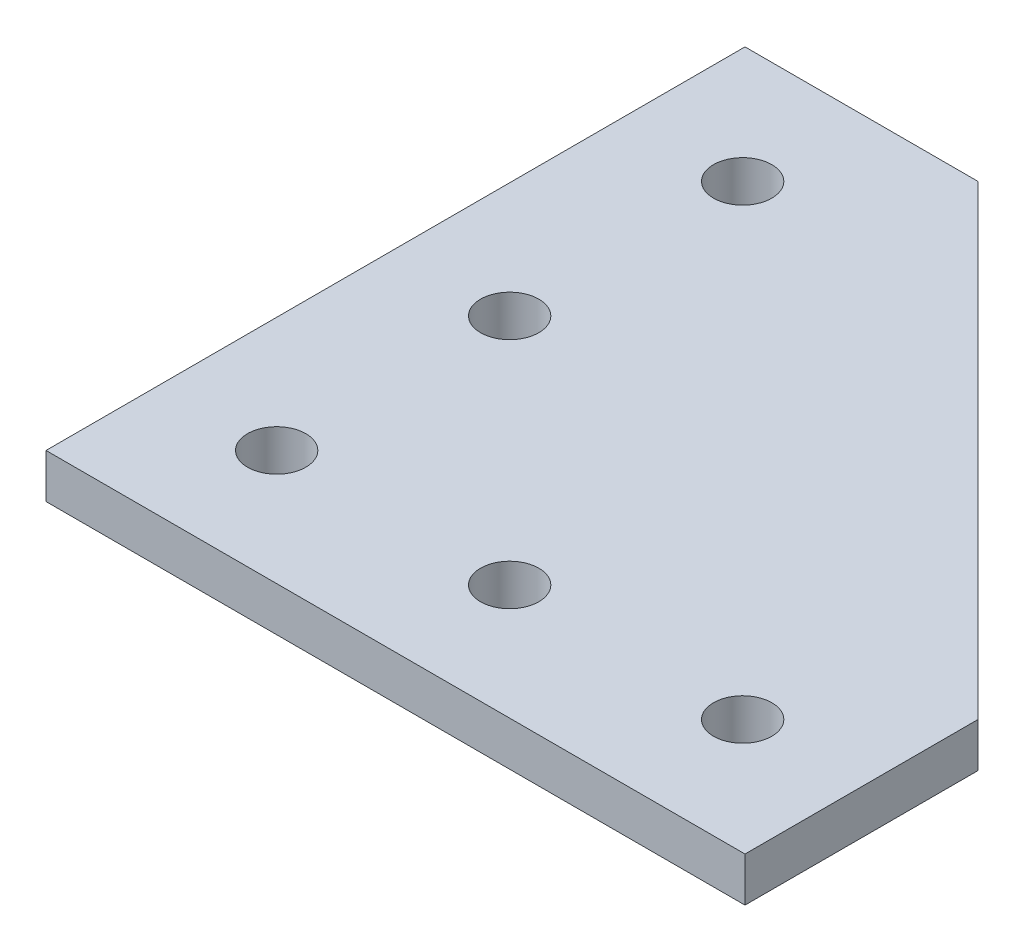
ISO-10303-21;
HEADER;
FILE_DESCRIPTION(('STEP AP214'),'2;1');
FILE_NAME('part.step','',(''),(''),'','','');
FILE_SCHEMA(('AUTOMOTIVE_DESIGN { 1 0 10303 214 1 1 1 1 }'));
ENDSEC;
DATA;
#1=APPLICATION_CONTEXT('core data for automotive mechanical design processes');
#2=APPLICATION_PROTOCOL_DEFINITION('international standard','automotive_design',2000,#1);
#3=PRODUCT_CONTEXT('',#1,'mechanical');
#4=PRODUCT('Part','Part','',(#3));
#5=PRODUCT_RELATED_PRODUCT_CATEGORY('part','',(#4));
#6=PRODUCT_DEFINITION_FORMATION('','',#4);
#7=PRODUCT_DEFINITION_CONTEXT('part definition',#1,'design');
#8=PRODUCT_DEFINITION('design','',#6,#7);
#9=PRODUCT_DEFINITION_SHAPE('','',#8);
#10=(LENGTH_UNIT() NAMED_UNIT(*) SI_UNIT(.MILLI.,.METRE.));
#11=(NAMED_UNIT(*) PLANE_ANGLE_UNIT() SI_UNIT($,.RADIAN.));
#12=(NAMED_UNIT(*) SI_UNIT($,.STERADIAN.) SOLID_ANGLE_UNIT());
#13=UNCERTAINTY_MEASURE_WITH_UNIT(LENGTH_MEASURE(1.E-05),#10,'distance_accuracy_value','');
#14=(GEOMETRIC_REPRESENTATION_CONTEXT(3) GLOBAL_UNCERTAINTY_ASSIGNED_CONTEXT((#13)) GLOBAL_UNIT_ASSIGNED_CONTEXT((#10,
#11,#12)) REPRESENTATION_CONTEXT('',''));
#15=CARTESIAN_POINT('',(0.,0.,0.));
#16=DIRECTION('',(0.,0.,1.));
#17=DIRECTION('',(1.,0.,0.));
#18=AXIS2_PLACEMENT_3D('',#15,#16,#17);
#19=CARTESIAN_POINT('',(0.,4.826,0.));
#20=DIRECTION('',(0.,1.,0.));
#21=DIRECTION('',(0.,0.,1.));
#22=AXIS2_PLACEMENT_3D('',#19,#20,#21);
#23=PLANE('',#22);
#24=CARTESIAN_POINT('',(12.573,4.826,-37.973));
#25=DIRECTION('',(0.,1.,0.));
#26=DIRECTION('',(0.,0.,1.));
#27=AXIS2_PLACEMENT_3D('',#24,#25,#26);
#28=CIRCLE('',#27,3.175);
#29=CARTESIAN_POINT('',(12.573,4.826,-34.798));
#30=VERTEX_POINT('',#29);
#31=EDGE_CURVE('E203',#30,#30,#28,.T.);
#32=ORIENTED_EDGE('',*,*,#31,.F.);
#33=EDGE_LOOP('',(#32));
#34=FACE_BOUND('',#33,.T.);
#35=CARTESIAN_POINT('',(37.973,4.826,-12.573));
#36=DIRECTION('',(0.,1.,0.));
#37=DIRECTION('',(0.,0.,1.));
#38=AXIS2_PLACEMENT_3D('',#35,#36,#37);
#39=CIRCLE('',#38,3.175);
#40=CARTESIAN_POINT('',(37.973,4.826,-9.39800000000001));
#41=VERTEX_POINT('',#40);
#42=EDGE_CURVE('E219',#41,#41,#39,.T.);
#43=ORIENTED_EDGE('',*,*,#42,.F.);
#44=EDGE_LOOP('',(#43));
#45=FACE_BOUND('',#44,.T.);
#46=DIRECTION('',(0.,0.,1.));
#47=VECTOR('',#46,1.);
#48=CARTESIAN_POINT('',(0.,4.826,-76.2));
#49=LINE('',#48,#47);
#50=CARTESIAN_POINT('',(0.,4.826,-76.2));
#51=VERTEX_POINT('',#50);
#52=CARTESIAN_POINT('',(0.,4.826,0.));
#53=VERTEX_POINT('',#52);
#54=EDGE_CURVE('E139',#51,#53,#49,.T.);
#55=ORIENTED_EDGE('',*,*,#54,.T.);
#56=DIRECTION('',(1.,0.,0.));
#57=VECTOR('',#56,1.);
#58=CARTESIAN_POINT('',(0.,4.826,0.));
#59=LINE('',#58,#57);
#60=CARTESIAN_POINT('',(76.2,4.826,0.));
#61=VERTEX_POINT('',#60);
#62=EDGE_CURVE('E97',#53,#61,#59,.T.);
#63=ORIENTED_EDGE('',*,*,#62,.T.);
#64=DIRECTION('',(0.,0.,-1.));
#65=VECTOR('',#64,1.);
#66=CARTESIAN_POINT('',(76.2,4.826,0.));
#67=LINE('',#66,#65);
#68=CARTESIAN_POINT('',(76.2,4.826,-25.4));
#69=VERTEX_POINT('',#68);
#70=EDGE_CURVE('E101',#61,#69,#67,.T.);
#71=ORIENTED_EDGE('',*,*,#70,.T.);
#72=DIRECTION('',(-0.707106781186548,0.,-0.707106781186547));
#73=VECTOR('',#72,1.);
#74=CARTESIAN_POINT('',(76.2,4.826,-25.4));
#75=LINE('',#74,#73);
#76=CARTESIAN_POINT('',(25.4,4.826,-76.2));
#77=VERTEX_POINT('',#76);
#78=EDGE_CURVE('E105',#69,#77,#75,.T.);
#79=ORIENTED_EDGE('',*,*,#78,.T.);
#80=DIRECTION('',(-1.,0.,0.));
#81=VECTOR('',#80,1.);
#82=CARTESIAN_POINT('',(25.4,4.826,-76.2));
#83=LINE('',#82,#81);
#84=EDGE_CURVE('E63',#77,#51,#83,.T.);
#85=ORIENTED_EDGE('',*,*,#84,.T.);
#86=EDGE_LOOP('',(#55,#63,#71,#79,#85));
#87=FACE_BOUND('',#86,.T.);
#88=CARTESIAN_POINT('',(12.573,4.826,-12.573));
#89=DIRECTION('',(0.,1.,0.));
#90=DIRECTION('',(0.,0.,1.));
#91=AXIS2_PLACEMENT_3D('',#88,#89,#90);
#92=CIRCLE('',#91,3.175);
#93=CARTESIAN_POINT('',(12.573,4.826,-9.398));
#94=VERTEX_POINT('',#93);
#95=EDGE_CURVE('E130',#94,#94,#92,.T.);
#96=ORIENTED_EDGE('',*,*,#95,.F.);
#97=EDGE_LOOP('',(#96));
#98=FACE_BOUND('',#97,.T.);
#99=CARTESIAN_POINT('',(63.373,4.826,-12.573));
#100=DIRECTION('',(0.,1.,0.));
#101=DIRECTION('',(0.,0.,1.));
#102=AXIS2_PLACEMENT_3D('',#99,#100,#101);
#103=CIRCLE('',#102,3.175);
#104=CARTESIAN_POINT('',(63.373,4.826,-9.39800000000001));
#105=VERTEX_POINT('',#104);
#106=EDGE_CURVE('E211',#105,#105,#103,.T.);
#107=ORIENTED_EDGE('',*,*,#106,.F.);
#108=EDGE_LOOP('',(#107));
#109=FACE_BOUND('',#108,.T.);
#110=CARTESIAN_POINT('',(12.573,4.826,-63.373));
#111=DIRECTION('',(0.,1.,0.));
#112=DIRECTION('',(0.,0.,1.));
#113=AXIS2_PLACEMENT_3D('',#110,#111,#112);
#114=CIRCLE('',#113,3.175);
#115=CARTESIAN_POINT('',(12.573,4.826,-60.198));
#116=VERTEX_POINT('',#115);
#117=EDGE_CURVE('E192',#116,#116,#114,.T.);
#118=ORIENTED_EDGE('',*,*,#117,.F.);
#119=EDGE_LOOP('',(#118));
#120=FACE_BOUND('',#119,.T.);
#121=ADVANCED_FACE('F45',(#34,#45,#87,#98,#109,#120),#23,.T.);
#122=CARTESIAN_POINT('',(0.,0.,0.));
#123=DIRECTION('',(0.,1.,0.));
#124=DIRECTION('',(0.,0.,1.));
#125=AXIS2_PLACEMENT_3D('',#122,#123,#124);
#126=PLANE('',#125);
#127=DIRECTION('',(0.,0.,1.));
#128=VECTOR('',#127,1.);
#129=CARTESIAN_POINT('',(0.,0.,-76.2));
#130=LINE('',#129,#128);
#131=CARTESIAN_POINT('',(0.,0.,-76.2));
#132=VERTEX_POINT('',#131);
#133=CARTESIAN_POINT('',(0.,0.,0.));
#134=VERTEX_POINT('',#133);
#135=EDGE_CURVE('E125',#132,#134,#130,.T.);
#136=ORIENTED_EDGE('',*,*,#135,.F.);
#137=DIRECTION('',(-1.,0.,0.));
#138=VECTOR('',#137,1.);
#139=CARTESIAN_POINT('',(25.4,0.,-76.2));
#140=LINE('',#139,#138);
#141=CARTESIAN_POINT('',(25.4,0.,-76.2));
#142=VERTEX_POINT('',#141);
#143=EDGE_CURVE('E89',#142,#132,#140,.T.);
#144=ORIENTED_EDGE('',*,*,#143,.F.);
#145=DIRECTION('',(-0.707106781186548,0.,-0.707106781186547));
#146=VECTOR('',#145,1.);
#147=CARTESIAN_POINT('',(76.2,0.,-25.4));
#148=LINE('',#147,#146);
#149=CARTESIAN_POINT('',(76.2,0.,-25.4));
#150=VERTEX_POINT('',#149);
#151=EDGE_CURVE('E83',#150,#142,#148,.T.);
#152=ORIENTED_EDGE('',*,*,#151,.F.);
#153=DIRECTION('',(0.,0.,-1.));
#154=VECTOR('',#153,1.);
#155=CARTESIAN_POINT('',(76.2,0.,0.));
#156=LINE('',#155,#154);
#157=CARTESIAN_POINT('',(76.2,0.,0.));
#158=VERTEX_POINT('',#157);
#159=EDGE_CURVE('E113',#158,#150,#156,.T.);
#160=ORIENTED_EDGE('',*,*,#159,.F.);
#161=DIRECTION('',(1.,0.,0.));
#162=VECTOR('',#161,1.);
#163=CARTESIAN_POINT('',(0.,0.,0.));
#164=LINE('',#163,#162);
#165=EDGE_CURVE('E129',#134,#158,#164,.T.);
#166=ORIENTED_EDGE('',*,*,#165,.F.);
#167=EDGE_LOOP('',(#136,#144,#152,#160,#166));
#168=FACE_BOUND('',#167,.T.);
#169=CARTESIAN_POINT('',(12.573,0.,-12.573));
#170=DIRECTION('',(0.,1.,0.));
#171=DIRECTION('',(0.,0.,1.));
#172=AXIS2_PLACEMENT_3D('',#169,#170,#171);
#173=CIRCLE('',#172,3.175);
#174=CARTESIAN_POINT('',(12.573,0.,-9.398));
#175=VERTEX_POINT('',#174);
#176=EDGE_CURVE('E223',#175,#175,#173,.T.);
#177=ORIENTED_EDGE('',*,*,#176,.T.);
#178=EDGE_LOOP('',(#177));
#179=FACE_BOUND('',#178,.T.);
#180=CARTESIAN_POINT('',(37.973,0.,-12.573));
#181=DIRECTION('',(0.,1.,0.));
#182=DIRECTION('',(0.,0.,1.));
#183=AXIS2_PLACEMENT_3D('',#180,#181,#182);
#184=CIRCLE('',#183,3.175);
#185=CARTESIAN_POINT('',(37.973,0.,-9.39800000000001));
#186=VERTEX_POINT('',#185);
#187=EDGE_CURVE('E215',#186,#186,#184,.T.);
#188=ORIENTED_EDGE('',*,*,#187,.T.);
#189=EDGE_LOOP('',(#188));
#190=FACE_BOUND('',#189,.T.);
#191=CARTESIAN_POINT('',(63.373,0.,-12.573));
#192=DIRECTION('',(0.,1.,0.));
#193=DIRECTION('',(0.,0.,1.));
#194=AXIS2_PLACEMENT_3D('',#191,#192,#193);
#195=CIRCLE('',#194,3.175);
#196=CARTESIAN_POINT('',(63.373,0.,-9.39800000000001));
#197=VERTEX_POINT('',#196);
#198=EDGE_CURVE('E207',#197,#197,#195,.T.);
#199=ORIENTED_EDGE('',*,*,#198,.T.);
#200=EDGE_LOOP('',(#199));
#201=FACE_BOUND('',#200,.T.);
#202=CARTESIAN_POINT('',(12.573,0.,-37.973));
#203=DIRECTION('',(0.,1.,0.));
#204=DIRECTION('',(0.,0.,1.));
#205=AXIS2_PLACEMENT_3D('',#202,#203,#204);
#206=CIRCLE('',#205,3.175);
#207=CARTESIAN_POINT('',(12.573,0.,-34.798));
#208=VERTEX_POINT('',#207);
#209=EDGE_CURVE('E200',#208,#208,#206,.T.);
#210=ORIENTED_EDGE('',*,*,#209,.T.);
#211=EDGE_LOOP('',(#210));
#212=FACE_BOUND('',#211,.T.);
#213=CARTESIAN_POINT('',(12.573,0.,-63.373));
#214=DIRECTION('',(0.,1.,0.));
#215=DIRECTION('',(0.,0.,1.));
#216=AXIS2_PLACEMENT_3D('',#213,#214,#215);
#217=CIRCLE('',#216,3.175);
#218=CARTESIAN_POINT('',(12.573,0.,-60.198));
#219=VERTEX_POINT('',#218);
#220=EDGE_CURVE('E195',#219,#219,#217,.T.);
#221=ORIENTED_EDGE('',*,*,#220,.T.);
#222=EDGE_LOOP('',(#221));
#223=FACE_BOUND('',#222,.T.);
#224=ADVANCED_FACE('F146',(#168,#179,#190,#201,#212,#223),#126,.F.);
#225=CARTESIAN_POINT('',(0.,4.826,-76.2));
#226=DIRECTION('',(1.,0.,0.));
#227=DIRECTION('',(0.,0.,-1.));
#228=AXIS2_PLACEMENT_3D('',#225,#226,#227);
#229=PLANE('',#228);
#230=ORIENTED_EDGE('',*,*,#135,.T.);
#231=DIRECTION('',(0.,-1.,0.));
#232=VECTOR('',#231,1.);
#233=CARTESIAN_POINT('',(0.,4.826,0.));
#234=LINE('',#233,#232);
#235=EDGE_CURVE('E11',#53,#134,#234,.T.);
#236=ORIENTED_EDGE('',*,*,#235,.F.);
#237=ORIENTED_EDGE('',*,*,#54,.F.);
#238=DIRECTION('',(0.,-1.,0.));
#239=VECTOR('',#238,1.);
#240=CARTESIAN_POINT('',(0.,4.826,-76.2));
#241=LINE('',#240,#239);
#242=EDGE_CURVE('E121',#51,#132,#241,.T.);
#243=ORIENTED_EDGE('',*,*,#242,.T.);
#244=EDGE_LOOP('',(#230,#236,#237,#243));
#245=FACE_BOUND('',#244,.T.);
#246=ADVANCED_FACE('F47',(#245),#229,.F.);
#247=CARTESIAN_POINT('',(0.,4.826,0.));
#248=DIRECTION('',(0.,0.,-1.));
#249=DIRECTION('',(-1.,0.,0.));
#250=AXIS2_PLACEMENT_3D('',#247,#248,#249);
#251=PLANE('',#250);
#252=ORIENTED_EDGE('',*,*,#165,.T.);
#253=DIRECTION('',(0.,-1.,0.));
#254=VECTOR('',#253,1.);
#255=CARTESIAN_POINT('',(76.2,4.826,0.));
#256=LINE('',#255,#254);
#257=EDGE_CURVE('E55',#61,#158,#256,.T.);
#258=ORIENTED_EDGE('',*,*,#257,.F.);
#259=ORIENTED_EDGE('',*,*,#62,.F.);
#260=ORIENTED_EDGE('',*,*,#235,.T.);
#261=EDGE_LOOP('',(#252,#258,#259,#260));
#262=FACE_BOUND('',#261,.T.);
#263=ADVANCED_FACE('F291',(#262),#251,.F.);
#264=CARTESIAN_POINT('',(76.2,4.826,0.));
#265=DIRECTION('',(-1.,0.,0.));
#266=DIRECTION('',(0.,0.,1.));
#267=AXIS2_PLACEMENT_3D('',#264,#265,#266);
#268=PLANE('',#267);
#269=ORIENTED_EDGE('',*,*,#159,.T.);
#270=DIRECTION('',(0.,-1.,0.));
#271=VECTOR('',#270,1.);
#272=CARTESIAN_POINT('',(76.2,4.826,-25.4));
#273=LINE('',#272,#271);
#274=EDGE_CURVE('E110',#69,#150,#273,.T.);
#275=ORIENTED_EDGE('',*,*,#274,.F.);
#276=ORIENTED_EDGE('',*,*,#70,.F.);
#277=ORIENTED_EDGE('',*,*,#257,.T.);
#278=EDGE_LOOP('',(#269,#275,#276,#277));
#279=FACE_BOUND('',#278,.T.);
#280=ADVANCED_FACE('F111',(#279),#268,.F.);
#281=CARTESIAN_POINT('',(76.2,4.826,-25.4));
#282=DIRECTION('',(-0.707106781186547,0.,0.707106781186548));
#283=DIRECTION('',(0.707106781186548,0.,0.707106781186547));
#284=AXIS2_PLACEMENT_3D('',#281,#282,#283);
#285=PLANE('',#284);
#286=ORIENTED_EDGE('',*,*,#151,.T.);
#287=DIRECTION('',(0.,-1.,0.));
#288=VECTOR('',#287,1.);
#289=CARTESIAN_POINT('',(25.4,4.826,-76.2));
#290=LINE('',#289,#288);
#291=EDGE_CURVE('E115',#77,#142,#290,.T.);
#292=ORIENTED_EDGE('',*,*,#291,.F.);
#293=ORIENTED_EDGE('',*,*,#78,.F.);
#294=ORIENTED_EDGE('',*,*,#274,.T.);
#295=EDGE_LOOP('',(#286,#292,#293,#294));
#296=FACE_BOUND('',#295,.T.);
#297=ADVANCED_FACE('F117',(#296),#285,.F.);
#298=CARTESIAN_POINT('',(25.4,4.826,-76.2));
#299=DIRECTION('',(0.,0.,1.));
#300=DIRECTION('',(1.,0.,0.));
#301=AXIS2_PLACEMENT_3D('',#298,#299,#300);
#302=PLANE('',#301);
#303=ORIENTED_EDGE('',*,*,#143,.T.);
#304=ORIENTED_EDGE('',*,*,#242,.F.);
#305=ORIENTED_EDGE('',*,*,#84,.F.);
#306=ORIENTED_EDGE('',*,*,#291,.T.);
#307=EDGE_LOOP('',(#303,#304,#305,#306));
#308=FACE_BOUND('',#307,.T.);
#309=ADVANCED_FACE('F151',(#308),#302,.F.);
#310=CARTESIAN_POINT('',(12.573,4.826,-12.573));
#311=DIRECTION('',(0.,-1.,0.));
#312=DIRECTION('',(0.,0.,-1.));
#313=AXIS2_PLACEMENT_3D('',#310,#311,#312);
#314=CYLINDRICAL_SURFACE('',#313,3.175);
#315=ORIENTED_EDGE('',*,*,#95,.T.);
#316=EDGE_LOOP('',(#315));
#317=FACE_BOUND('',#316,.T.);
#318=ORIENTED_EDGE('',*,*,#176,.F.);
#319=EDGE_LOOP('',(#318));
#320=FACE_BOUND('',#319,.T.);
#321=ADVANCED_FACE('F153',(#317,#320),#314,.F.);
#322=CARTESIAN_POINT('',(37.973,4.826,-12.573));
#323=DIRECTION('',(0.,-1.,0.));
#324=DIRECTION('',(0.,0.,-1.));
#325=AXIS2_PLACEMENT_3D('',#322,#323,#324);
#326=CYLINDRICAL_SURFACE('',#325,3.175);
#327=ORIENTED_EDGE('',*,*,#42,.T.);
#328=EDGE_LOOP('',(#327));
#329=FACE_BOUND('',#328,.T.);
#330=ORIENTED_EDGE('',*,*,#187,.F.);
#331=EDGE_LOOP('',(#330));
#332=FACE_BOUND('',#331,.T.);
#333=ADVANCED_FACE('F159',(#329,#332),#326,.F.);
#334=CARTESIAN_POINT('',(63.373,4.826,-12.573));
#335=DIRECTION('',(0.,-1.,0.));
#336=DIRECTION('',(0.,0.,-1.));
#337=AXIS2_PLACEMENT_3D('',#334,#335,#336);
#338=CYLINDRICAL_SURFACE('',#337,3.175);
#339=ORIENTED_EDGE('',*,*,#106,.T.);
#340=EDGE_LOOP('',(#339));
#341=FACE_BOUND('',#340,.T.);
#342=ORIENTED_EDGE('',*,*,#198,.F.);
#343=EDGE_LOOP('',(#342));
#344=FACE_BOUND('',#343,.T.);
#345=ADVANCED_FACE('F175',(#341,#344),#338,.F.);
#346=CARTESIAN_POINT('',(12.573,4.826,-37.973));
#347=DIRECTION('',(0.,-1.,0.));
#348=DIRECTION('',(0.,0.,-1.));
#349=AXIS2_PLACEMENT_3D('',#346,#347,#348);
#350=CYLINDRICAL_SURFACE('',#349,3.175);
#351=ORIENTED_EDGE('',*,*,#31,.T.);
#352=EDGE_LOOP('',(#351));
#353=FACE_BOUND('',#352,.T.);
#354=ORIENTED_EDGE('',*,*,#209,.F.);
#355=EDGE_LOOP('',(#354));
#356=FACE_BOUND('',#355,.T.);
#357=ADVANCED_FACE('F179',(#353,#356),#350,.F.);
#358=CARTESIAN_POINT('',(12.573,4.826,-63.373));
#359=DIRECTION('',(0.,-1.,0.));
#360=DIRECTION('',(0.,0.,-1.));
#361=AXIS2_PLACEMENT_3D('',#358,#359,#360);
#362=CYLINDRICAL_SURFACE('',#361,3.175);
#363=ORIENTED_EDGE('',*,*,#117,.T.);
#364=EDGE_LOOP('',(#363));
#365=FACE_BOUND('',#364,.T.);
#366=ORIENTED_EDGE('',*,*,#220,.F.);
#367=EDGE_LOOP('',(#366));
#368=FACE_BOUND('',#367,.T.);
#369=ADVANCED_FACE('F183',(#365,#368),#362,.F.);
#370=CLOSED_SHELL('',(#121,#224,#246,#263,#280,#297,#309,#321,#333,#345,#357,#369));
#371=MANIFOLD_SOLID_BREP('B2',#370);
#372=ADVANCED_BREP_SHAPE_REPRESENTATION('',(#18,#371),#14);
#373=SHAPE_DEFINITION_REPRESENTATION(#9,#372);
ENDSEC;
END-ISO-10303-21;
